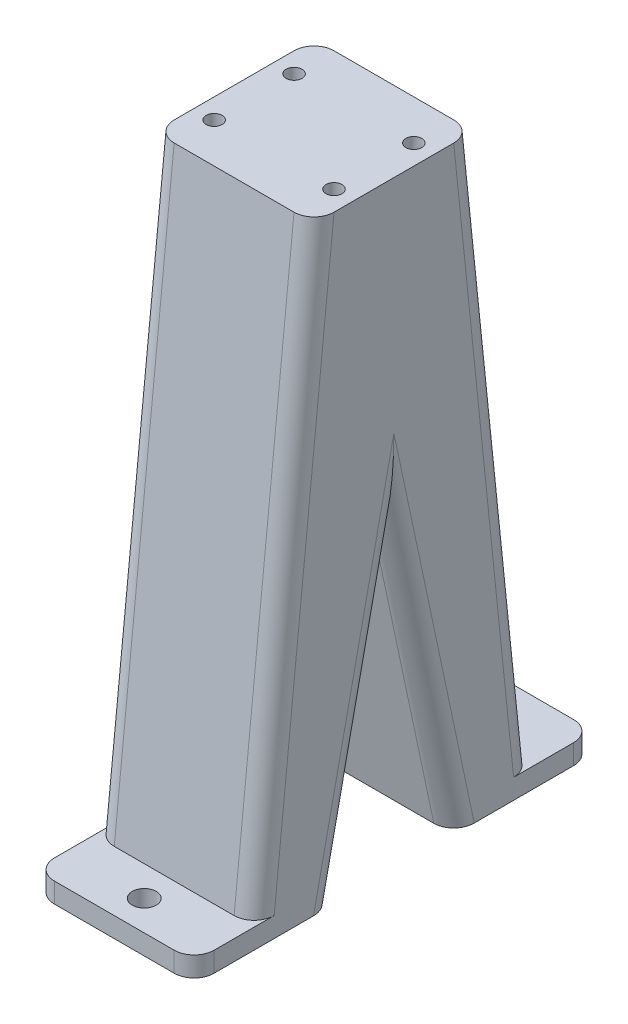
ISO-10303-21;
HEADER;
FILE_DESCRIPTION(('STEP AP214'),'2;1');
FILE_NAME('part.step','',(''),(''),'','','');
FILE_SCHEMA(('AUTOMOTIVE_DESIGN { 1 0 10303 214 1 1 1 1 }'));
ENDSEC;
DATA;
#1=APPLICATION_CONTEXT('core data for automotive mechanical design processes');
#2=APPLICATION_PROTOCOL_DEFINITION('international standard','automotive_design',2000,#1);
#3=PRODUCT_CONTEXT('',#1,'mechanical');
#4=PRODUCT('Part','Part','',(#3));
#5=PRODUCT_RELATED_PRODUCT_CATEGORY('part','',(#4));
#6=PRODUCT_DEFINITION_FORMATION('','',#4);
#7=PRODUCT_DEFINITION_CONTEXT('part definition',#1,'design');
#8=PRODUCT_DEFINITION('design','',#6,#7);
#9=PRODUCT_DEFINITION_SHAPE('','',#8);
#10=(LENGTH_UNIT() NAMED_UNIT(*) SI_UNIT(.MILLI.,.METRE.));
#11=(NAMED_UNIT(*) PLANE_ANGLE_UNIT() SI_UNIT($,.RADIAN.));
#12=(NAMED_UNIT(*) SI_UNIT($,.STERADIAN.) SOLID_ANGLE_UNIT());
#13=UNCERTAINTY_MEASURE_WITH_UNIT(LENGTH_MEASURE(1.E-05),#10,'distance_accuracy_value','');
#14=(GEOMETRIC_REPRESENTATION_CONTEXT(3) GLOBAL_UNCERTAINTY_ASSIGNED_CONTEXT((#13)) GLOBAL_UNIT_ASSIGNED_CONTEXT((#10,
#11,#12)) REPRESENTATION_CONTEXT('',''));
#15=CARTESIAN_POINT('',(0.,0.,0.));
#16=DIRECTION('',(0.,0.,1.));
#17=DIRECTION('',(1.,0.,0.));
#18=AXIS2_PLACEMENT_3D('',#15,#16,#17);
#19=CARTESIAN_POINT('',(40.,150.,-20.));
#20=DIRECTION('',(0.,-0.102899151085505,0.994691793826551));
#21=DIRECTION('',(0.,-0.994691793826551,-0.102899151085505));
#22=AXIS2_PLACEMENT_3D('',#19,#20,#21);
#23=PLANE('',#22);
#24=DIRECTION('',(-1.,0.,0.));
#25=VECTOR('',#24,1.);
#26=CARTESIAN_POINT('',(40.,5.00000000000001,-35.));
#27=LINE('',#26,#25);
#28=CARTESIAN_POINT('',(35.,5.00000000000001,-35.));
#29=VERTEX_POINT('',#28);
#30=CARTESIAN_POINT('',(5.,5.00000000000001,-35.));
#31=VERTEX_POINT('',#30);
#32=EDGE_CURVE('E408',#29,#31,#27,.T.);
#33=ORIENTED_EDGE('',*,*,#32,.T.);
#34=DIRECTION('',(0.,0.994691793826551,0.102899151085505));
#35=VECTOR('',#34,1.);
#36=CARTESIAN_POINT('',(5.,150.,-20.));
#37=LINE('',#36,#35);
#38=CARTESIAN_POINT('',(5.,150.,-20.));
#39=VERTEX_POINT('',#38);
#40=EDGE_CURVE('E319',#31,#39,#37,.T.);
#41=ORIENTED_EDGE('',*,*,#40,.T.);
#42=DIRECTION('',(-1.,0.,0.));
#43=VECTOR('',#42,1.);
#44=CARTESIAN_POINT('',(40.,150.,-20.));
#45=LINE('',#44,#43);
#46=CARTESIAN_POINT('',(35.,150.,-20.));
#47=VERTEX_POINT('',#46);
#48=EDGE_CURVE('E230',#47,#39,#45,.T.);
#49=ORIENTED_EDGE('',*,*,#48,.F.);
#50=DIRECTION('',(0.,0.994691793826551,0.102899151085505));
#51=VECTOR('',#50,1.);
#52=CARTESIAN_POINT('',(35.,5.00000000000002,-35.));
#53=LINE('',#52,#51);
#54=EDGE_CURVE('E323',#47,#29,#53,.F.);
#55=ORIENTED_EDGE('',*,*,#54,.T.);
#56=EDGE_LOOP('',(#33,#41,#49,#55));
#57=FACE_BOUND('',#56,.T.);
#58=ADVANCED_FACE('F45',(#57),#23,.F.);
#59=CARTESIAN_POINT('',(40.,150.,20.));
#60=DIRECTION('',(0.,-1.,0.));
#61=DIRECTION('',(0.,0.,-1.));
#62=AXIS2_PLACEMENT_3D('',#59,#60,#61);
#63=PLANE('',#62);
#64=CARTESIAN_POINT('',(5.,150.,10.));
#65=DIRECTION('',(0.,1.,0.));
#66=DIRECTION('',(0.,0.,1.));
#67=AXIS2_PLACEMENT_3D('',#64,#65,#66);
#68=CIRCLE('',#67,2.);
#69=CARTESIAN_POINT('',(5.,150.,12.));
#70=VERTEX_POINT('',#69);
#71=EDGE_CURVE('E237',#70,#70,#68,.T.);
#72=ORIENTED_EDGE('',*,*,#71,.F.);
#73=EDGE_LOOP('',(#72));
#74=FACE_BOUND('',#73,.T.);
#75=CARTESIAN_POINT('',(5.,150.,-10.));
#76=DIRECTION('',(0.,1.,0.));
#77=DIRECTION('',(0.,0.,1.));
#78=AXIS2_PLACEMENT_3D('',#75,#76,#77);
#79=CIRCLE('',#78,2.);
#80=CARTESIAN_POINT('',(5.,150.,-8.));
#81=VERTEX_POINT('',#80);
#82=EDGE_CURVE('E470',#81,#81,#79,.T.);
#83=ORIENTED_EDGE('',*,*,#82,.F.);
#84=EDGE_LOOP('',(#83));
#85=FACE_BOUND('',#84,.T.);
#86=CARTESIAN_POINT('',(35.,150.,-10.));
#87=DIRECTION('',(0.,1.,0.));
#88=DIRECTION('',(0.,0.,1.));
#89=AXIS2_PLACEMENT_3D('',#86,#87,#88);
#90=CIRCLE('',#89,2.);
#91=CARTESIAN_POINT('',(35.,150.,-8.));
#92=VERTEX_POINT('',#91);
#93=EDGE_CURVE('E478',#92,#92,#90,.T.);
#94=ORIENTED_EDGE('',*,*,#93,.F.);
#95=EDGE_LOOP('',(#94));
#96=FACE_BOUND('',#95,.T.);
#97=CARTESIAN_POINT('',(35.,150.,10.));
#98=DIRECTION('',(0.,1.,0.));
#99=DIRECTION('',(0.,0.,1.));
#100=AXIS2_PLACEMENT_3D('',#97,#98,#99);
#101=CIRCLE('',#100,2.);
#102=CARTESIAN_POINT('',(35.,150.,12.));
#103=VERTEX_POINT('',#102);
#104=EDGE_CURVE('E459',#103,#103,#101,.T.);
#105=ORIENTED_EDGE('',*,*,#104,.F.);
#106=EDGE_LOOP('',(#105));
#107=FACE_BOUND('',#106,.T.);
#108=ORIENTED_EDGE('',*,*,#48,.T.);
#109=CARTESIAN_POINT('',(5.,150.,-14.9733173320299));
#110=DIRECTION('',(0.,-1.,0.));
#111=DIRECTION('',(0.,0.,1.));
#112=AXIS2_PLACEMENT_3D('',#109,#110,#111);
#113=ELLIPSE('',#112,5.02668266797009,5.);
#114=CARTESIAN_POINT('',(0.,150.,-14.9733173320299));
#115=VERTEX_POINT('',#114);
#116=EDGE_CURVE('E307',#39,#115,#113,.F.);
#117=ORIENTED_EDGE('',*,*,#116,.T.);
#118=DIRECTION('',(0.,0.,1.));
#119=VECTOR('',#118,1.);
#120=CARTESIAN_POINT('',(0.,150.,20.));
#121=LINE('',#120,#119);
#122=CARTESIAN_POINT('',(0.,150.,14.9733173320299));
#123=VERTEX_POINT('',#122);
#124=EDGE_CURVE('E375',#115,#123,#121,.T.);
#125=ORIENTED_EDGE('',*,*,#124,.T.);
#126=CARTESIAN_POINT('',(5.,150.,14.9733173320299));
#127=DIRECTION('',(0.,-1.,0.));
#128=DIRECTION('',(0.,0.,1.));
#129=AXIS2_PLACEMENT_3D('',#126,#127,#128);
#130=ELLIPSE('',#129,5.02668266797009,5.);
#131=CARTESIAN_POINT('',(5.,150.,20.));
#132=VERTEX_POINT('',#131);
#133=EDGE_CURVE('E310',#123,#132,#130,.F.);
#134=ORIENTED_EDGE('',*,*,#133,.T.);
#135=DIRECTION('',(-1.,0.,0.));
#136=VECTOR('',#135,1.);
#137=CARTESIAN_POINT('',(40.,150.,20.));
#138=LINE('',#137,#136);
#139=CARTESIAN_POINT('',(35.,150.,20.));
#140=VERTEX_POINT('',#139);
#141=EDGE_CURVE('E380',#140,#132,#138,.T.);
#142=ORIENTED_EDGE('',*,*,#141,.F.);
#143=CARTESIAN_POINT('',(35.,150.,14.9733173320299));
#144=DIRECTION('',(0.,-1.,0.));
#145=DIRECTION('',(0.,0.,-1.));
#146=AXIS2_PLACEMENT_3D('',#143,#144,#145);
#147=ELLIPSE('',#146,5.02668266797009,5.);
#148=CARTESIAN_POINT('',(40.,150.,14.9733173320299));
#149=VERTEX_POINT('',#148);
#150=EDGE_CURVE('E316',#140,#149,#147,.F.);
#151=ORIENTED_EDGE('',*,*,#150,.T.);
#152=DIRECTION('',(0.,0.,1.));
#153=VECTOR('',#152,1.);
#154=CARTESIAN_POINT('',(40.,150.,20.));
#155=LINE('',#154,#153);
#156=CARTESIAN_POINT('',(40.,150.,-14.9733173320299));
#157=VERTEX_POINT('',#156);
#158=EDGE_CURVE('E415',#157,#149,#155,.T.);
#159=ORIENTED_EDGE('',*,*,#158,.F.);
#160=CARTESIAN_POINT('',(35.,150.,-14.9733173320299));
#161=DIRECTION('',(0.,-1.,0.));
#162=DIRECTION('',(0.,0.,-1.));
#163=AXIS2_PLACEMENT_3D('',#160,#161,#162);
#164=ELLIPSE('',#163,5.02668266797009,5.);
#165=EDGE_CURVE('E313',#157,#47,#164,.F.);
#166=ORIENTED_EDGE('',*,*,#165,.T.);
#167=EDGE_LOOP('',(#108,#117,#125,#134,#142,#151,#159,#166));
#168=FACE_BOUND('',#167,.T.);
#169=ADVANCED_FACE('F495',(#74,#85,#96,#107,#168),#63,.F.);
#170=CARTESIAN_POINT('',(40.,5.,35.));
#171=DIRECTION('',(0.,-0.102899151085505,-0.994691793826551));
#172=DIRECTION('',(0.,0.994691793826551,-0.102899151085505));
#173=AXIS2_PLACEMENT_3D('',#170,#171,#172);
#174=PLANE('',#173);
#175=ORIENTED_EDGE('',*,*,#141,.T.);
#176=DIRECTION('',(0.,-0.994691793826551,0.102899151085505));
#177=VECTOR('',#176,1.);
#178=CARTESIAN_POINT('',(5.,5.,35.));
#179=LINE('',#178,#177);
#180=CARTESIAN_POINT('',(5.,5.,35.));
#181=VERTEX_POINT('',#180);
#182=EDGE_CURVE('E287',#132,#181,#179,.T.);
#183=ORIENTED_EDGE('',*,*,#182,.T.);
#184=DIRECTION('',(-1.,0.,0.));
#185=VECTOR('',#184,1.);
#186=CARTESIAN_POINT('',(40.,5.,35.));
#187=LINE('',#186,#185);
#188=CARTESIAN_POINT('',(35.,5.,35.));
#189=VERTEX_POINT('',#188);
#190=EDGE_CURVE('E384',#189,#181,#187,.T.);
#191=ORIENTED_EDGE('',*,*,#190,.F.);
#192=DIRECTION('',(0.,-0.994691793826551,0.102899151085505));
#193=VECTOR('',#192,1.);
#194=CARTESIAN_POINT('',(35.,150.,20.));
#195=LINE('',#194,#193);
#196=EDGE_CURVE('E291',#189,#140,#195,.F.);
#197=ORIENTED_EDGE('',*,*,#196,.T.);
#198=EDGE_LOOP('',(#175,#183,#191,#197));
#199=FACE_BOUND('',#198,.T.);
#200=ADVANCED_FACE('F498',(#199),#174,.F.);
#201=CARTESIAN_POINT('',(40.,5.,50.));
#202=DIRECTION('',(0.,-1.,0.));
#203=DIRECTION('',(0.,0.,-1.));
#204=AXIS2_PLACEMENT_3D('',#201,#202,#203);
#205=PLANE('',#204);
#206=CARTESIAN_POINT('',(20.,5.,42.5));
#207=DIRECTION('',(0.,1.,0.));
#208=DIRECTION('',(0.,0.,1.));
#209=AXIS2_PLACEMENT_3D('',#206,#207,#208);
#210=CIRCLE('',#209,3.);
#211=CARTESIAN_POINT('',(20.,5.,45.5));
#212=VERTEX_POINT('',#211);
#213=EDGE_CURVE('E451',#212,#212,#210,.T.);
#214=ORIENTED_EDGE('',*,*,#213,.F.);
#215=EDGE_LOOP('',(#214));
#216=FACE_BOUND('',#215,.T.);
#217=DIRECTION('',(0.,0.,1.));
#218=VECTOR('',#217,1.);
#219=CARTESIAN_POINT('',(0.,5.,50.));
#220=LINE('',#219,#218);
#221=CARTESIAN_POINT('',(0.,5.,29.9733173320299));
#222=VERTEX_POINT('',#221);
#223=CARTESIAN_POINT('',(0.,5.,45.));
#224=VERTEX_POINT('',#223);
#225=EDGE_CURVE('E424',#222,#224,#220,.T.);
#226=ORIENTED_EDGE('',*,*,#225,.T.);
#227=CARTESIAN_POINT('',(5.,5.,45.));
#228=DIRECTION('',(0.,-1.,0.));
#229=DIRECTION('',(0.,0.,-1.));
#230=AXIS2_PLACEMENT_3D('',#227,#228,#229);
#231=CIRCLE('',#230,5.);
#232=CARTESIAN_POINT('',(5.,5.,50.));
#233=VERTEX_POINT('',#232);
#234=EDGE_CURVE('E274',#224,#233,#231,.F.);
#235=ORIENTED_EDGE('',*,*,#234,.T.);
#236=DIRECTION('',(-1.,0.,0.));
#237=VECTOR('',#236,1.);
#238=CARTESIAN_POINT('',(40.,5.,50.));
#239=LINE('',#238,#237);
#240=CARTESIAN_POINT('',(35.,5.,50.));
#241=VERTEX_POINT('',#240);
#242=EDGE_CURVE('E388',#241,#233,#239,.T.);
#243=ORIENTED_EDGE('',*,*,#242,.F.);
#244=CARTESIAN_POINT('',(35.,5.,45.));
#245=DIRECTION('',(0.,-1.,0.));
#246=DIRECTION('',(0.,0.,-1.));
#247=AXIS2_PLACEMENT_3D('',#244,#245,#246);
#248=CIRCLE('',#247,5.);
#249=CARTESIAN_POINT('',(40.,5.,45.));
#250=VERTEX_POINT('',#249);
#251=EDGE_CURVE('E277',#241,#250,#248,.F.);
#252=ORIENTED_EDGE('',*,*,#251,.T.);
#253=DIRECTION('',(0.,0.,1.));
#254=VECTOR('',#253,1.);
#255=CARTESIAN_POINT('',(40.,5.,50.));
#256=LINE('',#255,#254);
#257=CARTESIAN_POINT('',(40.,5.,29.9733173320299));
#258=VERTEX_POINT('',#257);
#259=EDGE_CURVE('E440',#258,#250,#256,.T.);
#260=ORIENTED_EDGE('',*,*,#259,.F.);
#261=CARTESIAN_POINT('',(35.,5.,29.9733173320299));
#262=DIRECTION('',(0.,-1.,0.));
#263=DIRECTION('',(0.,0.,-1.));
#264=AXIS2_PLACEMENT_3D('',#261,#262,#263);
#265=ELLIPSE('',#264,5.02668266797009,5.);
#266=EDGE_CURVE('E11',#258,#189,#265,.T.);
#267=ORIENTED_EDGE('',*,*,#266,.T.);
#268=ORIENTED_EDGE('',*,*,#190,.T.);
#269=CARTESIAN_POINT('',(5.,5.,29.9733173320299));
#270=DIRECTION('',(0.,-1.,0.));
#271=DIRECTION('',(0.,0.,1.));
#272=AXIS2_PLACEMENT_3D('',#269,#270,#271);
#273=ELLIPSE('',#272,5.02668266797009,5.);
#274=EDGE_CURVE('E249',#181,#222,#273,.T.);
#275=ORIENTED_EDGE('',*,*,#274,.T.);
#276=EDGE_LOOP('',(#226,#235,#243,#252,#260,#267,#268,#275));
#277=FACE_BOUND('',#276,.T.);
#278=ADVANCED_FACE('F534',(#216,#277),#205,.F.);
#279=CARTESIAN_POINT('',(40.,0.,50.));
#280=DIRECTION('',(0.,0.,-1.));
#281=DIRECTION('',(-1.,0.,0.));
#282=AXIS2_PLACEMENT_3D('',#279,#280,#281);
#283=PLANE('',#282);
#284=ORIENTED_EDGE('',*,*,#242,.T.);
#285=DIRECTION('',(0.,-1.,0.));
#286=VECTOR('',#285,1.);
#287=CARTESIAN_POINT('',(5.,0.,50.));
#288=LINE('',#287,#286);
#289=CARTESIAN_POINT('',(5.,0.,50.));
#290=VERTEX_POINT('',#289);
#291=EDGE_CURVE('E280',#233,#290,#288,.T.);
#292=ORIENTED_EDGE('',*,*,#291,.T.);
#293=DIRECTION('',(-1.,0.,0.));
#294=VECTOR('',#293,1.);
#295=CARTESIAN_POINT('',(40.,0.,50.));
#296=LINE('',#295,#294);
#297=CARTESIAN_POINT('',(35.,0.,50.));
#298=VERTEX_POINT('',#297);
#299=EDGE_CURVE('E392',#298,#290,#296,.T.);
#300=ORIENTED_EDGE('',*,*,#299,.F.);
#301=DIRECTION('',(0.,-1.,0.));
#302=VECTOR('',#301,1.);
#303=CARTESIAN_POINT('',(35.,5.,50.));
#304=LINE('',#303,#302);
#305=EDGE_CURVE('E284',#298,#241,#304,.F.);
#306=ORIENTED_EDGE('',*,*,#305,.T.);
#307=EDGE_LOOP('',(#284,#292,#300,#306));
#308=FACE_BOUND('',#307,.T.);
#309=ADVANCED_FACE('F550',(#308),#283,.F.);
#310=CARTESIAN_POINT('',(40.,0.,15.));
#311=DIRECTION('',(0.,1.,0.));
#312=DIRECTION('',(0.,0.,1.));
#313=AXIS2_PLACEMENT_3D('',#310,#311,#312);
#314=PLANE('',#313);
#315=CARTESIAN_POINT('',(20.,0.,42.5));
#316=DIRECTION('',(0.,1.,0.));
#317=DIRECTION('',(0.,0.,1.));
#318=AXIS2_PLACEMENT_3D('',#315,#316,#317);
#319=CIRCLE('',#318,3.);
#320=CARTESIAN_POINT('',(20.,0.,45.5));
#321=VERTEX_POINT('',#320);
#322=EDGE_CURVE('E371',#321,#321,#319,.T.);
#323=ORIENTED_EDGE('',*,*,#322,.T.);
#324=EDGE_LOOP('',(#323));
#325=FACE_BOUND('',#324,.T.);
#326=DIRECTION('',(0.,0.,-1.));
#327=VECTOR('',#326,1.);
#328=CARTESIAN_POINT('',(0.,0.,15.));
#329=LINE('',#328,#327);
#330=CARTESIAN_POINT('',(0.,0.,45.));
#331=VERTEX_POINT('',#330);
#332=CARTESIAN_POINT('',(0.,0.,20.1118303531812));
#333=VERTEX_POINT('',#332);
#334=EDGE_CURVE('E420',#331,#333,#329,.T.);
#335=ORIENTED_EDGE('',*,*,#334,.T.);
#336=CARTESIAN_POINT('',(5.,0.,20.1118303531812));
#337=DIRECTION('',(0.,1.,0.));
#338=DIRECTION('',(0.,0.,-1.));
#339=AXIS2_PLACEMENT_3D('',#336,#337,#338);
#340=ELLIPSE('',#339,5.11183035318118,5.);
#341=CARTESIAN_POINT('',(5.,0.,15.));
#342=VERTEX_POINT('',#341);
#343=EDGE_CURVE('E210',#333,#342,#340,.F.);
#344=ORIENTED_EDGE('',*,*,#343,.T.);
#345=DIRECTION('',(-1.,0.,0.));
#346=VECTOR('',#345,1.);
#347=CARTESIAN_POINT('',(40.,0.,15.));
#348=LINE('',#347,#346);
#349=CARTESIAN_POINT('',(35.,0.,15.));
#350=VERTEX_POINT('',#349);
#351=EDGE_CURVE('E222',#350,#342,#348,.T.);
#352=ORIENTED_EDGE('',*,*,#351,.F.);
#353=CARTESIAN_POINT('',(35.,0.,20.1118303531812));
#354=DIRECTION('',(0.,1.,0.));
#355=DIRECTION('',(0.,0.,1.));
#356=AXIS2_PLACEMENT_3D('',#353,#354,#355);
#357=ELLIPSE('',#356,5.11183035318118,5.);
#358=CARTESIAN_POINT('',(40.,0.,20.1118303531811));
#359=VERTEX_POINT('',#358);
#360=EDGE_CURVE('E228',#350,#359,#357,.F.);
#361=ORIENTED_EDGE('',*,*,#360,.T.);
#362=DIRECTION('',(0.,0.,-1.));
#363=VECTOR('',#362,1.);
#364=CARTESIAN_POINT('',(40.,0.,15.));
#365=LINE('',#364,#363);
#366=CARTESIAN_POINT('',(40.,0.,45.));
#367=VERTEX_POINT('',#366);
#368=EDGE_CURVE('E437',#367,#359,#365,.T.);
#369=ORIENTED_EDGE('',*,*,#368,.F.);
#370=CARTESIAN_POINT('',(35.,0.,45.));
#371=DIRECTION('',(0.,1.,0.));
#372=DIRECTION('',(0.,0.,1.));
#373=AXIS2_PLACEMENT_3D('',#370,#371,#372);
#374=CIRCLE('',#373,5.);
#375=EDGE_CURVE('E347',#367,#298,#374,.F.);
#376=ORIENTED_EDGE('',*,*,#375,.T.);
#377=ORIENTED_EDGE('',*,*,#299,.T.);
#378=CARTESIAN_POINT('',(5.,0.,45.));
#379=DIRECTION('',(0.,1.,0.));
#380=DIRECTION('',(0.,0.,1.));
#381=AXIS2_PLACEMENT_3D('',#378,#379,#380);
#382=CIRCLE('',#381,5.);
#383=EDGE_CURVE('E342',#290,#331,#382,.F.);
#384=ORIENTED_EDGE('',*,*,#383,.T.);
#385=EDGE_LOOP('',(#335,#344,#352,#361,#369,#376,#377,#384));
#386=FACE_BOUND('',#385,.T.);
#387=ADVANCED_FACE('F548',(#325,#386),#314,.F.);
#388=CARTESIAN_POINT('',(40.,70.5288053694706,0.));
#389=DIRECTION('',(0.,0.208026328043004,0.978123226818045));
#390=DIRECTION('',(0.,-0.978123226818045,0.208026328043004));
#391=AXIS2_PLACEMENT_3D('',#388,#389,#390);
#392=PLANE('',#391);
#393=ORIENTED_EDGE('',*,*,#351,.T.);
#394=DIRECTION('',(0.,0.978123226818045,-0.208026328043004));
#395=VECTOR('',#394,1.);
#396=CARTESIAN_POINT('',(5.,70.5288053694706,0.));
#397=LINE('',#396,#395);
#398=CARTESIAN_POINT('',(5.,70.5288053694706,0.));
#399=VERTEX_POINT('',#398);
#400=EDGE_CURVE('E220',#342,#399,#397,.T.);
#401=ORIENTED_EDGE('',*,*,#400,.T.);
#402=DIRECTION('',(-1.,0.,0.));
#403=VECTOR('',#402,1.);
#404=CARTESIAN_POINT('',(40.,70.5288053694706,0.));
#405=LINE('',#404,#403);
#406=CARTESIAN_POINT('',(35.,70.5288053694706,0.));
#407=VERTEX_POINT('',#406);
#408=EDGE_CURVE('E203',#407,#399,#405,.T.);
#409=ORIENTED_EDGE('',*,*,#408,.F.);
#410=DIRECTION('',(0.,0.978123226818045,-0.208026328043004));
#411=VECTOR('',#410,1.);
#412=CARTESIAN_POINT('',(35.,0.,15.));
#413=LINE('',#412,#411);
#414=EDGE_CURVE('E217',#407,#350,#413,.F.);
#415=ORIENTED_EDGE('',*,*,#414,.T.);
#416=EDGE_LOOP('',(#393,#401,#409,#415));
#417=FACE_BOUND('',#416,.T.);
#418=ADVANCED_FACE('F216',(#417),#392,.F.);
#419=CARTESIAN_POINT('',(40.,0.,-15.));
#420=DIRECTION('',(0.,0.208026328043004,-0.978123226818045));
#421=DIRECTION('',(0.,0.978123226818045,0.208026328043004));
#422=AXIS2_PLACEMENT_3D('',#419,#420,#421);
#423=PLANE('',#422);
#424=ORIENTED_EDGE('',*,*,#408,.T.);
#425=DIRECTION('',(0.,-0.978123226818045,-0.208026328043004));
#426=VECTOR('',#425,1.);
#427=CARTESIAN_POINT('',(5.,0.,-15.));
#428=LINE('',#427,#426);
#429=CARTESIAN_POINT('',(5.,0.,-15.));
#430=VERTEX_POINT('',#429);
#431=EDGE_CURVE('E209',#399,#430,#428,.T.);
#432=ORIENTED_EDGE('',*,*,#431,.T.);
#433=DIRECTION('',(-1.,0.,0.));
#434=VECTOR('',#433,1.);
#435=CARTESIAN_POINT('',(40.,0.,-15.));
#436=LINE('',#435,#434);
#437=CARTESIAN_POINT('',(35.,0.,-15.));
#438=VERTEX_POINT('',#437);
#439=EDGE_CURVE('E205',#438,#430,#436,.T.);
#440=ORIENTED_EDGE('',*,*,#439,.F.);
#441=DIRECTION('',(0.,-0.978123226818045,-0.208026328043004));
#442=VECTOR('',#441,1.);
#443=CARTESIAN_POINT('',(35.,70.5288053694706,0.));
#444=LINE('',#443,#442);
#445=EDGE_CURVE('E200',#438,#407,#444,.F.);
#446=ORIENTED_EDGE('',*,*,#445,.T.);
#447=EDGE_LOOP('',(#424,#432,#440,#446));
#448=FACE_BOUND('',#447,.T.);
#449=ADVANCED_FACE('F202',(#448),#423,.F.);
#450=CARTESIAN_POINT('',(40.,0.,-50.));
#451=DIRECTION('',(0.,1.,0.));
#452=DIRECTION('',(0.,0.,1.));
#453=AXIS2_PLACEMENT_3D('',#450,#451,#452);
#454=PLANE('',#453);
#455=CARTESIAN_POINT('',(20.,0.,-42.5));
#456=DIRECTION('',(0.,1.,0.));
#457=DIRECTION('',(0.,0.,1.));
#458=AXIS2_PLACEMENT_3D('',#455,#456,#457);
#459=CIRCLE('',#458,3.);
#460=CARTESIAN_POINT('',(20.,0.,-39.5));
#461=VERTEX_POINT('',#460);
#462=EDGE_CURVE('E376',#461,#461,#459,.T.);
#463=ORIENTED_EDGE('',*,*,#462,.T.);
#464=EDGE_LOOP('',(#463));
#465=FACE_BOUND('',#464,.T.);
#466=ORIENTED_EDGE('',*,*,#439,.T.);
#467=CARTESIAN_POINT('',(5.,0.,-20.1118303531812));
#468=DIRECTION('',(0.,1.,0.));
#469=DIRECTION('',(0.,0.,-1.));
#470=AXIS2_PLACEMENT_3D('',#467,#468,#469);
#471=ELLIPSE('',#470,5.11183035318118,5.);
#472=CARTESIAN_POINT('',(0.,0.,-20.1118303531812));
#473=VERTEX_POINT('',#472);
#474=EDGE_CURVE('E326',#430,#473,#471,.F.);
#475=ORIENTED_EDGE('',*,*,#474,.T.);
#476=DIRECTION('',(0.,0.,-1.));
#477=VECTOR('',#476,1.);
#478=CARTESIAN_POINT('',(0.,0.,-50.));
#479=LINE('',#478,#477);
#480=CARTESIAN_POINT('',(0.,0.,-45.));
#481=VERTEX_POINT('',#480);
#482=EDGE_CURVE('E416',#473,#481,#479,.T.);
#483=ORIENTED_EDGE('',*,*,#482,.T.);
#484=CARTESIAN_POINT('',(5.,0.,-45.));
#485=DIRECTION('',(0.,1.,0.));
#486=DIRECTION('',(0.,0.,1.));
#487=AXIS2_PLACEMENT_3D('',#484,#485,#486);
#488=CIRCLE('',#487,5.);
#489=CARTESIAN_POINT('',(5.,0.,-50.));
#490=VERTEX_POINT('',#489);
#491=EDGE_CURVE('E329',#481,#490,#488,.F.);
#492=ORIENTED_EDGE('',*,*,#491,.T.);
#493=DIRECTION('',(-1.,0.,0.));
#494=VECTOR('',#493,1.);
#495=CARTESIAN_POINT('',(40.,0.,-50.));
#496=LINE('',#495,#494);
#497=CARTESIAN_POINT('',(35.,0.,-50.));
#498=VERTEX_POINT('',#497);
#499=EDGE_CURVE('E400',#498,#490,#496,.T.);
#500=ORIENTED_EDGE('',*,*,#499,.F.);
#501=CARTESIAN_POINT('',(35.,0.,-45.));
#502=DIRECTION('',(0.,1.,0.));
#503=DIRECTION('',(0.,0.,1.));
#504=AXIS2_PLACEMENT_3D('',#501,#502,#503);
#505=CIRCLE('',#504,5.);
#506=CARTESIAN_POINT('',(40.,0.,-45.));
#507=VERTEX_POINT('',#506);
#508=EDGE_CURVE('E332',#498,#507,#505,.F.);
#509=ORIENTED_EDGE('',*,*,#508,.T.);
#510=DIRECTION('',(0.,0.,-1.));
#511=VECTOR('',#510,1.);
#512=CARTESIAN_POINT('',(40.,0.,-50.));
#513=LINE('',#512,#511);
#514=CARTESIAN_POINT('',(40.,0.,-20.1118303531812));
#515=VERTEX_POINT('',#514);
#516=EDGE_CURVE('E433',#515,#507,#513,.T.);
#517=ORIENTED_EDGE('',*,*,#516,.F.);
#518=CARTESIAN_POINT('',(35.,0.,-20.1118303531812));
#519=DIRECTION('',(0.,1.,0.));
#520=DIRECTION('',(0.,0.,1.));
#521=AXIS2_PLACEMENT_3D('',#518,#519,#520);
#522=ELLIPSE('',#521,5.11183035318118,5.);
#523=EDGE_CURVE('E335',#515,#438,#522,.F.);
#524=ORIENTED_EDGE('',*,*,#523,.T.);
#525=EDGE_LOOP('',(#466,#475,#483,#492,#500,#509,#517,#524));
#526=FACE_BOUND('',#525,.T.);
#527=ADVANCED_FACE('F566',(#465,#526),#454,.F.);
#528=CARTESIAN_POINT('',(40.,5.00000000000002,-50.));
#529=DIRECTION('',(0.,0.,1.));
#530=DIRECTION('',(1.,0.,0.));
#531=AXIS2_PLACEMENT_3D('',#528,#529,#530);
#532=PLANE('',#531);
#533=ORIENTED_EDGE('',*,*,#499,.T.);
#534=DIRECTION('',(0.,1.,0.));
#535=VECTOR('',#534,1.);
#536=CARTESIAN_POINT('',(5.,5.00000000000002,-50.));
#537=LINE('',#536,#535);
#538=CARTESIAN_POINT('',(5.,5.00000000000002,-50.));
#539=VERTEX_POINT('',#538);
#540=EDGE_CURVE('E300',#490,#539,#537,.T.);
#541=ORIENTED_EDGE('',*,*,#540,.T.);
#542=DIRECTION('',(-1.,0.,0.));
#543=VECTOR('',#542,1.);
#544=CARTESIAN_POINT('',(40.,5.00000000000002,-50.));
#545=LINE('',#544,#543);
#546=CARTESIAN_POINT('',(35.,5.00000000000002,-50.));
#547=VERTEX_POINT('',#546);
#548=EDGE_CURVE('E404',#547,#539,#545,.T.);
#549=ORIENTED_EDGE('',*,*,#548,.F.);
#550=DIRECTION('',(0.,1.,0.));
#551=VECTOR('',#550,1.);
#552=CARTESIAN_POINT('',(35.,0.,-50.));
#553=LINE('',#552,#551);
#554=EDGE_CURVE('E304',#547,#498,#553,.F.);
#555=ORIENTED_EDGE('',*,*,#554,.T.);
#556=EDGE_LOOP('',(#533,#541,#549,#555));
#557=FACE_BOUND('',#556,.T.);
#558=ADVANCED_FACE('F575',(#557),#532,.F.);
#559=CARTESIAN_POINT('',(40.,5.00000000000001,-35.));
#560=DIRECTION('',(0.,-1.,0.));
#561=DIRECTION('',(0.,0.,-1.));
#562=AXIS2_PLACEMENT_3D('',#559,#560,#561);
#563=PLANE('',#562);
#564=CARTESIAN_POINT('',(20.,5.00000000000001,-42.5));
#565=DIRECTION('',(0.,1.,0.));
#566=DIRECTION('',(0.,0.,1.));
#567=AXIS2_PLACEMENT_3D('',#564,#565,#566);
#568=CIRCLE('',#567,3.);
#569=CARTESIAN_POINT('',(20.,5.00000000000001,-39.5));
#570=VERTEX_POINT('',#569);
#571=EDGE_CURVE('E450',#570,#570,#568,.T.);
#572=ORIENTED_EDGE('',*,*,#571,.F.);
#573=EDGE_LOOP('',(#572));
#574=FACE_BOUND('',#573,.T.);
#575=ORIENTED_EDGE('',*,*,#548,.T.);
#576=CARTESIAN_POINT('',(5.,5.00000000000002,-45.));
#577=DIRECTION('',(0.,-1.,0.));
#578=DIRECTION('',(0.,0.,-1.));
#579=AXIS2_PLACEMENT_3D('',#576,#577,#578);
#580=CIRCLE('',#579,5.);
#581=CARTESIAN_POINT('',(0.,5.00000000000002,-45.));
#582=VERTEX_POINT('',#581);
#583=EDGE_CURVE('E294',#539,#582,#580,.F.);
#584=ORIENTED_EDGE('',*,*,#583,.T.);
#585=DIRECTION('',(0.,0.,1.));
#586=VECTOR('',#585,1.);
#587=CARTESIAN_POINT('',(0.,5.00000000000001,-35.));
#588=LINE('',#587,#586);
#589=CARTESIAN_POINT('',(0.,5.00000000000001,-29.9733173320299));
#590=VERTEX_POINT('',#589);
#591=EDGE_CURVE('E412',#582,#590,#588,.T.);
#592=ORIENTED_EDGE('',*,*,#591,.T.);
#593=CARTESIAN_POINT('',(5.,5.,-29.9733173320299));
#594=DIRECTION('',(0.,-1.,0.));
#595=DIRECTION('',(0.,0.,1.));
#596=AXIS2_PLACEMENT_3D('',#593,#594,#595);
#597=ELLIPSE('',#596,5.02668266797009,5.);
#598=EDGE_CURVE('E253',#590,#31,#597,.T.);
#599=ORIENTED_EDGE('',*,*,#598,.T.);
#600=ORIENTED_EDGE('',*,*,#32,.F.);
#601=CARTESIAN_POINT('',(35.,5.00000000000001,-29.9733173320299));
#602=DIRECTION('',(0.,-1.,0.));
#603=DIRECTION('',(0.,0.,-1.));
#604=AXIS2_PLACEMENT_3D('',#601,#602,#603);
#605=ELLIPSE('',#604,5.02668266797009,5.);
#606=CARTESIAN_POINT('',(40.,5.00000000000001,-29.9733173320299));
#607=VERTEX_POINT('',#606);
#608=EDGE_CURVE('E55',#29,#607,#605,.T.);
#609=ORIENTED_EDGE('',*,*,#608,.T.);
#610=DIRECTION('',(0.,0.,1.));
#611=VECTOR('',#610,1.);
#612=CARTESIAN_POINT('',(40.,5.00000000000001,-35.));
#613=LINE('',#612,#611);
#614=CARTESIAN_POINT('',(40.,5.00000000000002,-45.));
#615=VERTEX_POINT('',#614);
#616=EDGE_CURVE('E63',#615,#607,#613,.T.);
#617=ORIENTED_EDGE('',*,*,#616,.F.);
#618=CARTESIAN_POINT('',(35.,5.00000000000002,-45.));
#619=DIRECTION('',(0.,-1.,0.));
#620=DIRECTION('',(0.,0.,-1.));
#621=AXIS2_PLACEMENT_3D('',#618,#619,#620);
#622=CIRCLE('',#621,5.);
#623=EDGE_CURVE('E297',#615,#547,#622,.F.);
#624=ORIENTED_EDGE('',*,*,#623,.T.);
#625=EDGE_LOOP('',(#575,#584,#592,#599,#600,#609,#617,#624));
#626=FACE_BOUND('',#625,.T.);
#627=ADVANCED_FACE('F515',(#574,#626),#563,.F.);
#628=CARTESIAN_POINT('',(40.,0.,0.));
#629=DIRECTION('',(1.,0.,0.));
#630=DIRECTION('',(0.,0.,-1.));
#631=AXIS2_PLACEMENT_3D('',#628,#629,#630);
#632=PLANE('',#631);
#633=ORIENTED_EDGE('',*,*,#516,.T.);
#634=DIRECTION('',(0.,1.,0.));
#635=VECTOR('',#634,1.);
#636=CARTESIAN_POINT('',(40.,5.00000000000002,-45.));
#637=LINE('',#636,#635);
#638=EDGE_CURVE('E256',#507,#615,#637,.T.);
#639=ORIENTED_EDGE('',*,*,#638,.T.);
#640=ORIENTED_EDGE('',*,*,#616,.T.);
#641=DIRECTION('',(0.,0.994691793826551,0.102899151085505));
#642=VECTOR('',#641,1.);
#643=CARTESIAN_POINT('',(40.,149.485504244573,-15.0265410308672));
#644=LINE('',#643,#642);
#645=EDGE_CURVE('E259',#607,#157,#644,.T.);
#646=ORIENTED_EDGE('',*,*,#645,.T.);
#647=ORIENTED_EDGE('',*,*,#158,.T.);
#648=DIRECTION('',(0.,-0.994691793826551,0.102899151085505));
#649=VECTOR('',#648,1.);
#650=CARTESIAN_POINT('',(40.,4.48550424457247,30.0265410308672));
#651=LINE('',#650,#649);
#652=EDGE_CURVE('E270',#149,#258,#651,.T.);
#653=ORIENTED_EDGE('',*,*,#652,.T.);
#654=ORIENTED_EDGE('',*,*,#259,.T.);
#655=DIRECTION('',(0.,-1.,0.));
#656=VECTOR('',#655,1.);
#657=CARTESIAN_POINT('',(40.,0.,45.));
#658=LINE('',#657,#656);
#659=EDGE_CURVE('E266',#250,#367,#658,.T.);
#660=ORIENTED_EDGE('',*,*,#659,.T.);
#661=ORIENTED_EDGE('',*,*,#368,.T.);
#662=DIRECTION('',(0.,0.978123226818045,-0.208026328043004));
#663=VECTOR('',#662,1.);
#664=CARTESIAN_POINT('',(40.,71.5689370096856,4.89061613409022));
#665=LINE('',#664,#663);
#666=CARTESIAN_POINT('',(40.,94.5642245735551,0.));
#667=VERTEX_POINT('',#666);
#668=EDGE_CURVE('E70',#359,#667,#665,.T.);
#669=ORIENTED_EDGE('',*,*,#668,.T.);
#670=DIRECTION('',(0.,-0.978123226818045,-0.208026328043004));
#671=VECTOR('',#670,1.);
#672=CARTESIAN_POINT('',(40.,1.04013164021503,-19.8906161340903));
#673=LINE('',#672,#671);
#674=EDGE_CURVE('E233',#667,#515,#673,.T.);
#675=ORIENTED_EDGE('',*,*,#674,.T.);
#676=EDGE_LOOP('',(#633,#639,#640,#646,#647,#653,#654,#660,#661,#669,#675));
#677=FACE_BOUND('',#676,.T.);
#678=ADVANCED_FACE('F539',(#677),#632,.T.);
#679=CARTESIAN_POINT('',(0.,0.,0.));
#680=DIRECTION('',(1.,0.,0.));
#681=DIRECTION('',(0.,0.,-1.));
#682=AXIS2_PLACEMENT_3D('',#679,#680,#681);
#683=PLANE('',#682);
#684=DIRECTION('',(0.,-0.978123226818045,-0.208026328043004));
#685=VECTOR('',#684,1.);
#686=CARTESIAN_POINT('',(0.,4.09226238894302,-19.2414918367044));
#687=LINE('',#686,#685);
#688=CARTESIAN_POINT('',(0.,94.5642245735551,0.));
#689=VERTEX_POINT('',#688);
#690=EDGE_CURVE('E353',#473,#689,#687,.F.);
#691=ORIENTED_EDGE('',*,*,#690,.T.);
#692=DIRECTION('',(0.,0.978123226818045,-0.208026328043004));
#693=VECTOR('',#692,1.);
#694=CARTESIAN_POINT('',(0.,4.09226238894299,19.2414918367044));
#695=LINE('',#694,#693);
#696=EDGE_CURVE('E350',#689,#333,#695,.F.);
#697=ORIENTED_EDGE('',*,*,#696,.T.);
#698=ORIENTED_EDGE('',*,*,#334,.F.);
#699=DIRECTION('',(0.,-1.,0.));
#700=VECTOR('',#699,1.);
#701=CARTESIAN_POINT('',(0.,0.,45.));
#702=LINE('',#701,#700);
#703=EDGE_CURVE('E366',#331,#224,#702,.F.);
#704=ORIENTED_EDGE('',*,*,#703,.T.);
#705=ORIENTED_EDGE('',*,*,#225,.F.);
#706=DIRECTION('',(0.,-0.994691793826551,0.102899151085505));
#707=VECTOR('',#706,1.);
#708=CARTESIAN_POINT('',(0.,3.12079836221953,30.1677175014555));
#709=LINE('',#708,#707);
#710=EDGE_CURVE('E363',#222,#123,#709,.F.);
#711=ORIENTED_EDGE('',*,*,#710,.T.);
#712=ORIENTED_EDGE('',*,*,#124,.F.);
#713=DIRECTION('',(0.,0.994691793826551,0.102899151085505));
#714=VECTOR('',#713,1.);
#715=CARTESIAN_POINT('',(0.,3.12079836221954,-30.1677175014555));
#716=LINE('',#715,#714);
#717=EDGE_CURVE('E356',#115,#590,#716,.F.);
#718=ORIENTED_EDGE('',*,*,#717,.T.);
#719=ORIENTED_EDGE('',*,*,#591,.F.);
#720=DIRECTION('',(0.,1.,0.));
#721=VECTOR('',#720,1.);
#722=CARTESIAN_POINT('',(0.,0.,-45.));
#723=LINE('',#722,#721);
#724=EDGE_CURVE('E360',#582,#481,#723,.F.);
#725=ORIENTED_EDGE('',*,*,#724,.T.);
#726=ORIENTED_EDGE('',*,*,#482,.F.);
#727=EDGE_LOOP('',(#691,#697,#698,#704,#705,#711,#712,#718,#719,#725,#726));
#728=FACE_BOUND('',#727,.T.);
#729=ADVANCED_FACE('F522',(#728),#683,.F.);
#730=CARTESIAN_POINT('',(20.,-35.,-42.5));
#731=DIRECTION('',(0.,1.,0.));
#732=DIRECTION('',(0.,0.,1.));
#733=AXIS2_PLACEMENT_3D('',#730,#731,#732);
#734=CYLINDRICAL_SURFACE('',#733,3.);
#735=ORIENTED_EDGE('',*,*,#571,.T.);
#736=EDGE_LOOP('',(#735));
#737=FACE_BOUND('',#736,.T.);
#738=ORIENTED_EDGE('',*,*,#462,.F.);
#739=EDGE_LOOP('',(#738));
#740=FACE_BOUND('',#739,.T.);
#741=ADVANCED_FACE('F624',(#737,#740),#734,.F.);
#742=CARTESIAN_POINT('',(20.,-35.,42.5));
#743=DIRECTION('',(0.,1.,0.));
#744=DIRECTION('',(0.,0.,1.));
#745=AXIS2_PLACEMENT_3D('',#742,#743,#744);
#746=CYLINDRICAL_SURFACE('',#745,3.);
#747=ORIENTED_EDGE('',*,*,#213,.T.);
#748=EDGE_LOOP('',(#747));
#749=FACE_BOUND('',#748,.T.);
#750=ORIENTED_EDGE('',*,*,#322,.F.);
#751=EDGE_LOOP('',(#750));
#752=FACE_BOUND('',#751,.T.);
#753=ADVANCED_FACE('F622',(#749,#752),#746,.F.);
#754=CARTESIAN_POINT('',(35.,110.,10.));
#755=DIRECTION('',(0.,1.,0.));
#756=DIRECTION('',(0.,0.,1.));
#757=AXIS2_PLACEMENT_3D('',#754,#755,#756);
#758=CYLINDRICAL_SURFACE('',#757,2.);
#759=CARTESIAN_POINT('',(35.,110.,10.));
#760=DIRECTION('',(0.,1.,0.));
#761=DIRECTION('',(0.,0.,1.));
#762=AXIS2_PLACEMENT_3D('',#759,#760,#761);
#763=CIRCLE('',#762,2.);
#764=CARTESIAN_POINT('',(35.,110.,12.));
#765=VERTEX_POINT('',#764);
#766=EDGE_CURVE('E455',#765,#765,#763,.T.);
#767=ORIENTED_EDGE('',*,*,#766,.F.);
#768=EDGE_LOOP('',(#767));
#769=FACE_BOUND('',#768,.T.);
#770=ORIENTED_EDGE('',*,*,#104,.T.);
#771=EDGE_LOOP('',(#770));
#772=FACE_BOUND('',#771,.T.);
#773=ADVANCED_FACE('F618',(#769,#772),#758,.F.);
#774=CARTESIAN_POINT('',(0.,110.,0.));
#775=DIRECTION('',(0.,1.,0.));
#776=DIRECTION('',(0.,0.,1.));
#777=AXIS2_PLACEMENT_3D('',#774,#775,#776);
#778=PLANE('',#777);
#779=ORIENTED_EDGE('',*,*,#766,.T.);
#780=EDGE_LOOP('',(#779));
#781=FACE_BOUND('',#780,.T.);
#782=ADVANCED_FACE('F491',(#781),#778,.T.);
#783=CARTESIAN_POINT('',(35.,110.,-10.));
#784=DIRECTION('',(0.,1.,0.));
#785=DIRECTION('',(0.,0.,1.));
#786=AXIS2_PLACEMENT_3D('',#783,#784,#785);
#787=CYLINDRICAL_SURFACE('',#786,2.);
#788=CARTESIAN_POINT('',(35.,110.,-10.));
#789=DIRECTION('',(0.,1.,0.));
#790=DIRECTION('',(0.,0.,1.));
#791=AXIS2_PLACEMENT_3D('',#788,#789,#790);
#792=CIRCLE('',#791,2.);
#793=CARTESIAN_POINT('',(35.,110.,-8.));
#794=VERTEX_POINT('',#793);
#795=EDGE_CURVE('E463',#794,#794,#792,.T.);
#796=ORIENTED_EDGE('',*,*,#795,.F.);
#797=EDGE_LOOP('',(#796));
#798=FACE_BOUND('',#797,.T.);
#799=ORIENTED_EDGE('',*,*,#93,.T.);
#800=EDGE_LOOP('',(#799));
#801=FACE_BOUND('',#800,.T.);
#802=ADVANCED_FACE('F488',(#798,#801),#787,.F.);
#803=CARTESIAN_POINT('',(0.,110.,0.));
#804=DIRECTION('',(0.,1.,0.));
#805=DIRECTION('',(0.,0.,1.));
#806=AXIS2_PLACEMENT_3D('',#803,#804,#805);
#807=PLANE('',#806);
#808=ORIENTED_EDGE('',*,*,#795,.T.);
#809=EDGE_LOOP('',(#808));
#810=FACE_BOUND('',#809,.T.);
#811=ADVANCED_FACE('F486',(#810),#807,.T.);
#812=CARTESIAN_POINT('',(5.,110.,-10.));
#813=DIRECTION('',(0.,1.,0.));
#814=DIRECTION('',(0.,0.,1.));
#815=AXIS2_PLACEMENT_3D('',#812,#813,#814);
#816=CYLINDRICAL_SURFACE('',#815,2.);
#817=CARTESIAN_POINT('',(5.,110.,-10.));
#818=DIRECTION('',(0.,1.,0.));
#819=DIRECTION('',(0.,0.,1.));
#820=AXIS2_PLACEMENT_3D('',#817,#818,#819);
#821=CIRCLE('',#820,2.);
#822=CARTESIAN_POINT('',(5.,110.,-8.));
#823=VERTEX_POINT('',#822);
#824=EDGE_CURVE('E474',#823,#823,#821,.T.);
#825=ORIENTED_EDGE('',*,*,#824,.F.);
#826=EDGE_LOOP('',(#825));
#827=FACE_BOUND('',#826,.T.);
#828=ORIENTED_EDGE('',*,*,#82,.T.);
#829=EDGE_LOOP('',(#828));
#830=FACE_BOUND('',#829,.T.);
#831=ADVANCED_FACE('F613',(#827,#830),#816,.F.);
#832=CARTESIAN_POINT('',(0.,110.,0.));
#833=DIRECTION('',(0.,1.,0.));
#834=DIRECTION('',(0.,0.,1.));
#835=AXIS2_PLACEMENT_3D('',#832,#833,#834);
#836=PLANE('',#835);
#837=ORIENTED_EDGE('',*,*,#824,.T.);
#838=EDGE_LOOP('',(#837));
#839=FACE_BOUND('',#838,.T.);
#840=ADVANCED_FACE('F609',(#839),#836,.T.);
#841=CARTESIAN_POINT('',(5.,110.,10.));
#842=DIRECTION('',(0.,1.,0.));
#843=DIRECTION('',(0.,0.,1.));
#844=AXIS2_PLACEMENT_3D('',#841,#842,#843);
#845=CYLINDRICAL_SURFACE('',#844,2.);
#846=CARTESIAN_POINT('',(5.,110.,10.));
#847=DIRECTION('',(0.,1.,0.));
#848=DIRECTION('',(0.,0.,1.));
#849=AXIS2_PLACEMENT_3D('',#846,#847,#848);
#850=CIRCLE('',#849,2.);
#851=CARTESIAN_POINT('',(5.,110.,12.));
#852=VERTEX_POINT('',#851);
#853=EDGE_CURVE('E244',#852,#852,#850,.T.);
#854=ORIENTED_EDGE('',*,*,#853,.F.);
#855=EDGE_LOOP('',(#854));
#856=FACE_BOUND('',#855,.T.);
#857=ORIENTED_EDGE('',*,*,#71,.T.);
#858=EDGE_LOOP('',(#857));
#859=FACE_BOUND('',#858,.T.);
#860=ADVANCED_FACE('F603',(#856,#859),#845,.F.);
#861=CARTESIAN_POINT('',(0.,110.,0.));
#862=DIRECTION('',(0.,1.,0.));
#863=DIRECTION('',(0.,0.,1.));
#864=AXIS2_PLACEMENT_3D('',#861,#862,#863);
#865=PLANE('',#864);
#866=ORIENTED_EDGE('',*,*,#853,.T.);
#867=EDGE_LOOP('',(#866));
#868=FACE_BOUND('',#867,.T.);
#869=ADVANCED_FACE('F599',(#868),#865,.T.);
#870=CARTESIAN_POINT('',(5.,1.04013164021503,-19.8906161340903));
#871=DIRECTION('',(0.,-0.978123226818045,-0.208026328043004));
#872=DIRECTION('',(0.,0.208026328043004,-0.978123226818045));
#873=AXIS2_PLACEMENT_3D('',#870,#871,#872);
#874=CYLINDRICAL_SURFACE('',#873,5.);
#875=ORIENTED_EDGE('',*,*,#474,.F.);
#876=ORIENTED_EDGE('',*,*,#431,.F.);
#877=CARTESIAN_POINT('',(5.,94.5642245735552,0.));
#878=DIRECTION('',(0.,0.,-1.));
#879=DIRECTION('',(0.,1.,0.));
#880=AXIS2_PLACEMENT_3D('',#877,#878,#879);
#881=ELLIPSE('',#880,24.0354192040845,5.);
#882=EDGE_CURVE('E235',#689,#399,#881,.F.);
#883=ORIENTED_EDGE('',*,*,#882,.F.);
#884=ORIENTED_EDGE('',*,*,#690,.F.);
#885=EDGE_LOOP('',(#875,#876,#883,#884));
#886=FACE_BOUND('',#885,.T.);
#887=ADVANCED_FACE('F564',(#886),#874,.T.);
#888=CARTESIAN_POINT('',(5.,71.5689370096856,4.89061613409022));
#889=DIRECTION('',(0.,0.978123226818045,-0.208026328043004));
#890=DIRECTION('',(0.,0.208026328043004,0.978123226818045));
#891=AXIS2_PLACEMENT_3D('',#888,#889,#890);
#892=CYLINDRICAL_SURFACE('',#891,5.);
#893=ORIENTED_EDGE('',*,*,#343,.F.);
#894=ORIENTED_EDGE('',*,*,#696,.F.);
#895=ORIENTED_EDGE('',*,*,#882,.T.);
#896=ORIENTED_EDGE('',*,*,#400,.F.);
#897=EDGE_LOOP('',(#893,#894,#895,#896));
#898=FACE_BOUND('',#897,.T.);
#899=ADVANCED_FACE('F561',(#898),#892,.T.);
#900=CARTESIAN_POINT('',(5.,149.485504244572,-15.0265410308672));
#901=DIRECTION('',(0.,0.994691793826551,0.102899151085505));
#902=DIRECTION('',(0.,-0.102899151085505,0.994691793826551));
#903=AXIS2_PLACEMENT_3D('',#900,#901,#902);
#904=CYLINDRICAL_SURFACE('',#903,5.);
#905=ORIENTED_EDGE('',*,*,#598,.F.);
#906=ORIENTED_EDGE('',*,*,#717,.F.);
#907=ORIENTED_EDGE('',*,*,#116,.F.);
#908=ORIENTED_EDGE('',*,*,#40,.F.);
#909=EDGE_LOOP('',(#905,#906,#907,#908));
#910=FACE_BOUND('',#909,.T.);
#911=ADVANCED_FACE('F518',(#910),#904,.T.);
#912=CARTESIAN_POINT('',(5.,5.00000000000002,-45.));
#913=DIRECTION('',(0.,1.,0.));
#914=DIRECTION('',(0.,0.,1.));
#915=AXIS2_PLACEMENT_3D('',#912,#913,#914);
#916=CYLINDRICAL_SURFACE('',#915,5.);
#917=ORIENTED_EDGE('',*,*,#491,.F.);
#918=ORIENTED_EDGE('',*,*,#724,.F.);
#919=ORIENTED_EDGE('',*,*,#583,.F.);
#920=ORIENTED_EDGE('',*,*,#540,.F.);
#921=EDGE_LOOP('',(#917,#918,#919,#920));
#922=FACE_BOUND('',#921,.T.);
#923=ADVANCED_FACE('F580',(#922),#916,.T.);
#924=CARTESIAN_POINT('',(5.,4.48550424457247,30.0265410308672));
#925=DIRECTION('',(0.,-0.994691793826551,0.102899151085505));
#926=DIRECTION('',(0.,-0.102899151085505,-0.994691793826551));
#927=AXIS2_PLACEMENT_3D('',#924,#925,#926);
#928=CYLINDRICAL_SURFACE('',#927,5.);
#929=ORIENTED_EDGE('',*,*,#133,.F.);
#930=ORIENTED_EDGE('',*,*,#710,.F.);
#931=ORIENTED_EDGE('',*,*,#274,.F.);
#932=ORIENTED_EDGE('',*,*,#182,.F.);
#933=EDGE_LOOP('',(#929,#930,#931,#932));
#934=FACE_BOUND('',#933,.T.);
#935=ADVANCED_FACE('F529',(#934),#928,.T.);
#936=CARTESIAN_POINT('',(5.,0.,45.));
#937=DIRECTION('',(0.,-1.,0.));
#938=DIRECTION('',(0.,0.,-1.));
#939=AXIS2_PLACEMENT_3D('',#936,#937,#938);
#940=CYLINDRICAL_SURFACE('',#939,5.);
#941=ORIENTED_EDGE('',*,*,#234,.F.);
#942=ORIENTED_EDGE('',*,*,#703,.F.);
#943=ORIENTED_EDGE('',*,*,#383,.F.);
#944=ORIENTED_EDGE('',*,*,#291,.F.);
#945=EDGE_LOOP('',(#941,#942,#943,#944));
#946=FACE_BOUND('',#945,.T.);
#947=ADVANCED_FACE('F555',(#946),#940,.T.);
#948=CARTESIAN_POINT('',(35.,0.,-45.));
#949=DIRECTION('',(0.,-1.,0.));
#950=DIRECTION('',(0.,0.,-1.));
#951=AXIS2_PLACEMENT_3D('',#948,#949,#950);
#952=CYLINDRICAL_SURFACE('',#951,5.);
#953=ORIENTED_EDGE('',*,*,#508,.F.);
#954=ORIENTED_EDGE('',*,*,#554,.F.);
#955=ORIENTED_EDGE('',*,*,#623,.F.);
#956=ORIENTED_EDGE('',*,*,#638,.F.);
#957=EDGE_LOOP('',(#953,#954,#955,#956));
#958=FACE_BOUND('',#957,.T.);
#959=ADVANCED_FACE('F571',(#958),#952,.T.);
#960=CARTESIAN_POINT('',(35.,3.12079836221954,-30.1677175014555));
#961=DIRECTION('',(0.,-0.994691793826551,-0.102899151085505));
#962=DIRECTION('',(0.,0.102899151085505,-0.994691793826551));
#963=AXIS2_PLACEMENT_3D('',#960,#961,#962);
#964=CYLINDRICAL_SURFACE('',#963,5.);
#965=ORIENTED_EDGE('',*,*,#608,.F.);
#966=ORIENTED_EDGE('',*,*,#54,.F.);
#967=ORIENTED_EDGE('',*,*,#165,.F.);
#968=ORIENTED_EDGE('',*,*,#645,.F.);
#969=EDGE_LOOP('',(#965,#966,#967,#968));
#970=FACE_BOUND('',#969,.T.);
#971=ADVANCED_FACE('F512',(#970),#964,.T.);
#972=CARTESIAN_POINT('',(35.,4.09226238894299,19.2414918367044));
#973=DIRECTION('',(0.,-0.978123226818045,0.208026328043004));
#974=DIRECTION('',(0.,-0.208026328043004,-0.978123226818045));
#975=AXIS2_PLACEMENT_3D('',#972,#973,#974);
#976=CYLINDRICAL_SURFACE('',#975,5.);
#977=ORIENTED_EDGE('',*,*,#360,.F.);
#978=ORIENTED_EDGE('',*,*,#414,.F.);
#979=CARTESIAN_POINT('',(35.,94.5642245735551,0.));
#980=DIRECTION('',(0.,0.,1.));
#981=DIRECTION('',(0.,1.,0.));
#982=AXIS2_PLACEMENT_3D('',#979,#980,#981);
#983=ELLIPSE('',#982,24.0354192040845,5.);
#984=EDGE_CURVE('E49',#667,#407,#983,.F.);
#985=ORIENTED_EDGE('',*,*,#984,.F.);
#986=ORIENTED_EDGE('',*,*,#668,.F.);
#987=EDGE_LOOP('',(#977,#978,#985,#986));
#988=FACE_BOUND('',#987,.T.);
#989=ADVANCED_FACE('F226',(#988),#976,.T.);
#990=CARTESIAN_POINT('',(35.,4.09226238894302,-19.2414918367044));
#991=DIRECTION('',(0.,0.978123226818045,0.208026328043004));
#992=DIRECTION('',(0.,-0.208026328043004,0.978123226818045));
#993=AXIS2_PLACEMENT_3D('',#990,#991,#992);
#994=CYLINDRICAL_SURFACE('',#993,5.);
#995=ORIENTED_EDGE('',*,*,#984,.T.);
#996=ORIENTED_EDGE('',*,*,#445,.F.);
#997=ORIENTED_EDGE('',*,*,#523,.F.);
#998=ORIENTED_EDGE('',*,*,#674,.F.);
#999=EDGE_LOOP('',(#995,#996,#997,#998));
#1000=FACE_BOUND('',#999,.T.);
#1001=ADVANCED_FACE('F232',(#1000),#994,.T.);
#1002=CARTESIAN_POINT('',(35.,0.,45.));
#1003=DIRECTION('',(0.,1.,0.));
#1004=DIRECTION('',(0.,0.,1.));
#1005=AXIS2_PLACEMENT_3D('',#1002,#1003,#1004);
#1006=CYLINDRICAL_SURFACE('',#1005,5.);
#1007=ORIENTED_EDGE('',*,*,#251,.F.);
#1008=ORIENTED_EDGE('',*,*,#305,.F.);
#1009=ORIENTED_EDGE('',*,*,#375,.F.);
#1010=ORIENTED_EDGE('',*,*,#659,.F.);
#1011=EDGE_LOOP('',(#1007,#1008,#1009,#1010));
#1012=FACE_BOUND('',#1011,.T.);
#1013=ADVANCED_FACE('F544',(#1012),#1006,.T.);
#1014=CARTESIAN_POINT('',(35.,3.12079836221953,30.1677175014555));
#1015=DIRECTION('',(0.,0.994691793826551,-0.102899151085505));
#1016=DIRECTION('',(0.,0.102899151085505,0.994691793826551));
#1017=AXIS2_PLACEMENT_3D('',#1014,#1015,#1016);
#1018=CYLINDRICAL_SURFACE('',#1017,5.);
#1019=ORIENTED_EDGE('',*,*,#150,.F.);
#1020=ORIENTED_EDGE('',*,*,#196,.F.);
#1021=ORIENTED_EDGE('',*,*,#266,.F.);
#1022=ORIENTED_EDGE('',*,*,#652,.F.);
#1023=EDGE_LOOP('',(#1019,#1020,#1021,#1022));
#1024=FACE_BOUND('',#1023,.T.);
#1025=ADVANCED_FACE('F47',(#1024),#1018,.T.);
#1026=CLOSED_SHELL('',(#58,#169,#200,#278,#309,#387,#418,#449,#527,#558,#627,#678,#729,#741,
#753,#773,#782,#802,#811,#831,#840,#860,#869,#887,#899,#911,#923,#935,#947,#959,#971,#989,#1001,
#1013,#1025));
#1027=MANIFOLD_SOLID_BREP('B2',#1026);
#1028=ADVANCED_BREP_SHAPE_REPRESENTATION('',(#18,#1027),#14);
#1029=SHAPE_DEFINITION_REPRESENTATION(#9,#1028);
ENDSEC;
END-ISO-10303-21;
